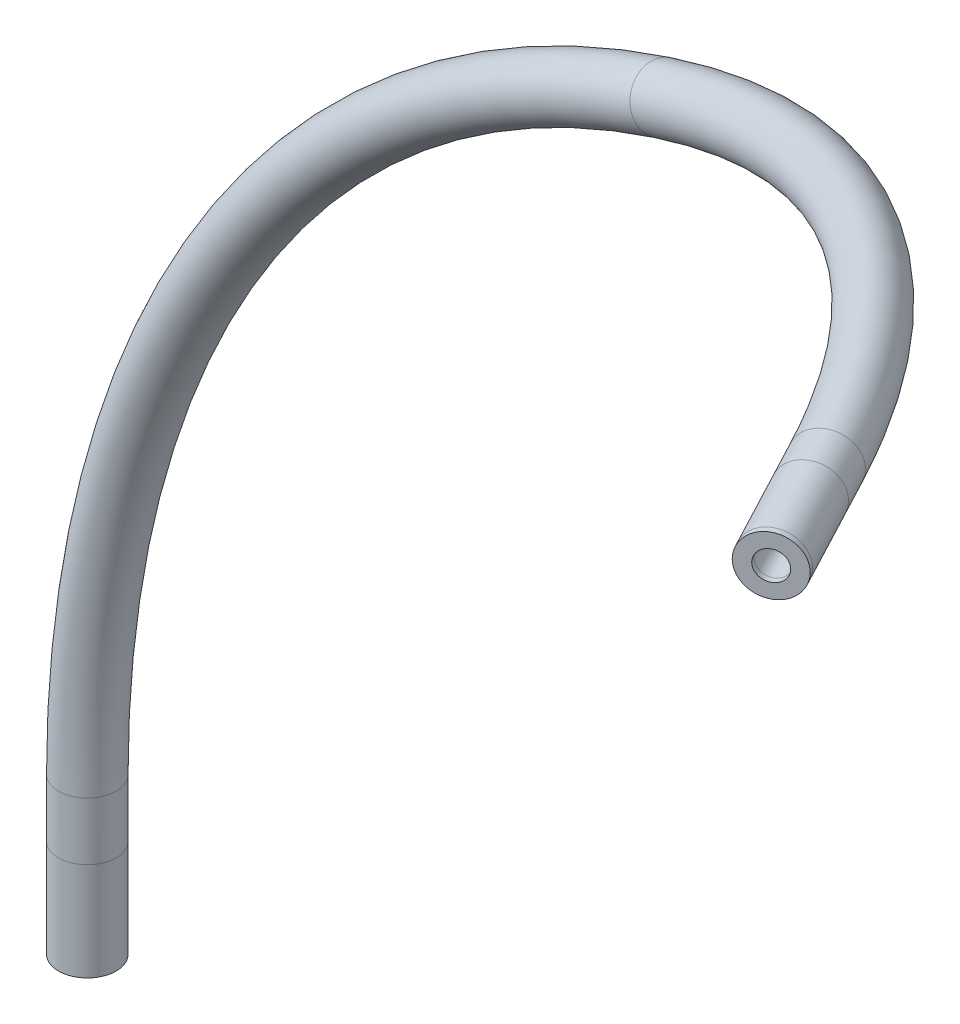
ISO-10303-21;
HEADER;
FILE_DESCRIPTION(('STEP AP214'),'2;1');
FILE_NAME('part.step','',(''),(''),'','','');
FILE_SCHEMA(('AUTOMOTIVE_DESIGN { 1 0 10303 214 1 1 1 1 }'));
ENDSEC;
DATA;
#1=APPLICATION_CONTEXT('core data for automotive mechanical design processes');
#2=APPLICATION_PROTOCOL_DEFINITION('international standard','automotive_design',2000,#1);
#3=PRODUCT_CONTEXT('',#1,'mechanical');
#4=PRODUCT('Part','Part','',(#3));
#5=PRODUCT_RELATED_PRODUCT_CATEGORY('part','',(#4));
#6=PRODUCT_DEFINITION_FORMATION('','',#4);
#7=PRODUCT_DEFINITION_CONTEXT('part definition',#1,'design');
#8=PRODUCT_DEFINITION('design','',#6,#7);
#9=PRODUCT_DEFINITION_SHAPE('','',#8);
#10=(LENGTH_UNIT() NAMED_UNIT(*) SI_UNIT(.MILLI.,.METRE.));
#11=(NAMED_UNIT(*) PLANE_ANGLE_UNIT() SI_UNIT($,.RADIAN.));
#12=(NAMED_UNIT(*) SI_UNIT($,.STERADIAN.) SOLID_ANGLE_UNIT());
#13=UNCERTAINTY_MEASURE_WITH_UNIT(LENGTH_MEASURE(1.E-05),#10,'distance_accuracy_value','');
#14=(GEOMETRIC_REPRESENTATION_CONTEXT(3) GLOBAL_UNCERTAINTY_ASSIGNED_CONTEXT((#13)) GLOBAL_UNIT_ASSIGNED_CONTEXT((#10,
#11,#12)) REPRESENTATION_CONTEXT('',''));
#15=CARTESIAN_POINT('',(0.,0.,0.));
#16=DIRECTION('',(0.,0.,1.));
#17=DIRECTION('',(1.,0.,0.));
#18=AXIS2_PLACEMENT_3D('',#15,#16,#17);
#19=CARTESIAN_POINT('',(31.09118456801,1264.71763543458,-29.1166792010292));
#20=DIRECTION('',(-4.11759515372978E-12,-1.,1.12676534769207E-12));
#21=DIRECTION('',(-0.296672887755822,2.29760654946176E-12,0.954979160856729));
#22=AXIS2_PLACEMENT_3D('',#19,#20,#21);
#23=PLANE('',#22);
#24=CARTESIAN_POINT('',(31.0911845680104,1264.71763543458,-29.1166792010293));
#25=DIRECTION('',(-4.11759515372978E-12,-1.,1.12676534769207E-12));
#26=DIRECTION('',(1.,-4.11759515372978E-12,0.));
#27=AXIS2_PLACEMENT_3D('',#24,#25,#26);
#28=CIRCLE('',#27,3.175);
#29=CARTESIAN_POINT('',(34.2661845680104,1264.71763543457,-29.1166792010293));
#30=VERTEX_POINT('',#29);
#31=EDGE_CURVE('E106',#30,#30,#28,.T.);
#32=ORIENTED_EDGE('',*,*,#31,.F.);
#33=EDGE_LOOP('',(#32));
#34=FACE_BOUND('',#33,.T.);
#35=CARTESIAN_POINT('',(31.09118456801,1264.71763543458,-29.1166792010292));
#36=DIRECTION('',(-4.11759515372978E-12,-1.,1.12676534769207E-12));
#37=DIRECTION('',(-0.296672887755822,2.29760654946176E-12,0.954979160856729));
#38=AXIS2_PLACEMENT_3D('',#35,#36,#37);
#39=CIRCLE('',#38,6.35000000000001);
#40=CARTESIAN_POINT('',(29.2073117307605,1264.71763543459,-23.052561529589));
#41=VERTEX_POINT('',#40);
#42=EDGE_CURVE('E102',#41,#41,#39,.T.);
#43=ORIENTED_EDGE('',*,*,#42,.T.);
#44=EDGE_LOOP('',(#43));
#45=FACE_BOUND('',#44,.T.);
#46=ADVANCED_FACE('F65',(#34,#45),#23,.T.);
#47=CARTESIAN_POINT('',(304.214888112565,1536.69544895664,93.4698034062031));
#48=DIRECTION('',(-0.469261662659723,-0.00663061794896908,-0.883034272756979));
#49=DIRECTION('',(-0.883053684739642,0.,0.469271978566524));
#50=AXIS2_PLACEMENT_3D('',#47,#48,#49);
#51=PLANE('',#50);
#52=CARTESIAN_POINT('',(304.214888112566,1536.69544895652,93.4698034062038));
#53=DIRECTION('',(-0.469261662659723,-0.00663061794896908,-0.883034272756979));
#54=DIRECTION('',(-0.883053684739642,0.,0.469271978566524));
#55=AXIS2_PLACEMENT_3D('',#52,#53,#54);
#56=CIRCLE('',#55,3.175);
#57=CARTESIAN_POINT('',(301.411192663517,1536.69544895652,94.9597419381525));
#58=VERTEX_POINT('',#57);
#59=EDGE_CURVE('E110',#58,#58,#56,.T.);
#60=ORIENTED_EDGE('',*,*,#59,.T.);
#61=EDGE_LOOP('',(#60));
#62=FACE_BOUND('',#61,.T.);
#63=CARTESIAN_POINT('',(304.214888112565,1536.69544895664,93.4698034062031));
#64=DIRECTION('',(-0.469261662659723,-0.00663061794896908,-0.883034272756979));
#65=DIRECTION('',(-0.883053684739642,0.,0.469271978566524));
#66=AXIS2_PLACEMENT_3D('',#63,#64,#65);
#67=CIRCLE('',#66,6.35000000000001);
#68=CARTESIAN_POINT('',(298.607497214468,1536.69544895664,96.4496804701005));
#69=VERTEX_POINT('',#68);
#70=EDGE_CURVE('E11',#69,#69,#67,.T.);
#71=ORIENTED_EDGE('',*,*,#70,.F.);
#72=EDGE_LOOP('',(#71));
#73=FACE_BOUND('',#72,.T.);
#74=ADVANCED_FACE('F140',(#62,#73),#51,.F.);
#75=CARTESIAN_POINT('',(31.09118456801,1264.71763543458,-29.1166792010292));
#76=DIRECTION('',(3.94125317015351E-12,1.,-1.14159106747005E-12));
#77=DIRECTION('',(-1.,3.94125317015351E-12,0.));
#78=AXIS2_PLACEMENT_3D('',#75,#76,#77);
#79=CYLINDRICAL_SURFACE('',#78,6.35000000000001);
#80=CARTESIAN_POINT('',(31.091184568095,1286.30763543458,-29.1166792010539));
#81=DIRECTION('',(-4.11759515372978E-12,-1.,1.12676534769207E-12));
#82=DIRECTION('',(-0.296672887755822,2.29760654946176E-12,0.954979160856729));
#83=AXIS2_PLACEMENT_3D('',#80,#81,#82);
#84=CIRCLE('',#83,6.35000000000001);
#85=CARTESIAN_POINT('',(29.2073117308455,1286.30763543459,-23.0525615296136));
#86=VERTEX_POINT('',#85);
#87=EDGE_CURVE('E98',#86,#86,#84,.T.);
#88=ORIENTED_EDGE('',*,*,#87,.T.);
#89=EDGE_LOOP('',(#88));
#90=FACE_BOUND('',#89,.T.);
#91=ORIENTED_EDGE('',*,*,#42,.F.);
#92=EDGE_LOOP('',(#91));
#93=FACE_BOUND('',#92,.T.);
#94=ADVANCED_FACE('F190',(#90,#93),#79,.T.);
#95=CARTESIAN_POINT('',(31.0911845680955,1286.30763543458,-29.1166792010538));
#96=DIRECTION('',(3.94069073086065E-12,1.,-1.13918061335798E-12));
#97=DIRECTION('',(-1.,3.94069073086065E-12,0.));
#98=AXIS2_PLACEMENT_3D('',#95,#96,#97);
#99=CYLINDRICAL_SURFACE('',#98,6.35000000000001);
#100=CARTESIAN_POINT('',(31.0911845681454,1299.00763543458,-29.1166792010683));
#101=DIRECTION('',(-4.11702616442966E-12,-1.,1.12437836818913E-12));
#102=DIRECTION('',(-0.296672887755822,2.29510854765635E-12,0.954979160856729));
#103=AXIS2_PLACEMENT_3D('',#100,#101,#102);
#104=CIRCLE('',#103,6.35000000000001);
#105=CARTESIAN_POINT('',(24.7713274061814,1299.0076354346,-29.7346641947015));
#106=VERTEX_POINT('',#105);
#107=EDGE_CURVE('E94',#106,#106,#104,.T.);
#108=ORIENTED_EDGE('',*,*,#107,.T.);
#109=EDGE_LOOP('',(#108));
#110=FACE_BOUND('',#109,.T.);
#111=ORIENTED_EDGE('',*,*,#87,.F.);
#112=EDGE_LOOP('',(#111));
#113=FACE_BOUND('',#112,.T.);
#114=ADVANCED_FACE('F192',(#110,#113),#99,.T.);
#115=CARTESIAN_POINT('',(251.153474751033,1299.00763543374,-7.59796611747635));
#116=DIRECTION('',(0.0973204714383247,-1.51938229919532E-12,-0.995253096372487));
#117=DIRECTION('',(-0.995253096372487,0.,-0.0973204714383248));
#118=AXIS2_PLACEMENT_3D('',#115,#116,#117);
#119=TOROIDAL_SURFACE('',#118,221.11188700138,6.35000000000001);
#120=CARTESIAN_POINT('',(171.500120085077,1505.12688026292,-15.386841184836));
#121=DIRECTION('',(-0.9277692819697,-0.361958219192179,-0.0907215905540296));
#122=DIRECTION('',(-0.168193497415296,0.188606763635169,0.967542472524219));
#123=AXIS2_PLACEMENT_3D('',#120,#121,#122);
#124=CIRCLE('',#123,6.35000000000001);
#125=CARTESIAN_POINT('',(169.212595841183,1511.04631418579,-15.6105259326281));
#126=VERTEX_POINT('',#125);
#127=EDGE_CURVE('E90',#126,#126,#124,.T.);
#128=CARTESIAN_POINT('',(251.153474751033,1299.00763543374,-7.59796611747635));
#129=DIRECTION('',(0.0973204714383247,-1.51938229919532E-12,-0.995253096372487));
#130=DIRECTION('',(-0.995253096372487,0.,-0.0973204714383248));
#131=AXIS2_PLACEMENT_3D('',#128,#129,#130);
#132=CIRCLE('',#131,227.46188700138);
#133=EDGE_CURVE('',#106,#126,#132,.T.);
#134=ORIENTED_EDGE('',*,*,#107,.F.);
#135=ORIENTED_EDGE('',*,*,#127,.T.);
#136=ORIENTED_EDGE('',*,*,#133,.T.);
#137=ORIENTED_EDGE('',*,*,#133,.F.);
#138=EDGE_LOOP('',(#134,#136,#135,#137));
#139=FACE_BOUND('',#138,.T.);
#140=ADVANCED_FACE('F199',(#139),#119,.T.);
#141=CARTESIAN_POINT('',(169.521268889301,1473.20357530099,132.216611157745));
#142=DIRECTION('',(0.372924235293047,-0.90791419309011,-0.1913617848909));
#143=DIRECTION('',(0.925008752116301,0.37994579680297,0.));
#144=AXIS2_PLACEMENT_3D('',#141,#142,#143);
#145=TOROIDAL_SURFACE('',#144,151.029111085233,6.35000000000001);
#146=CARTESIAN_POINT('',(290.412596724833,1536.50042403065,67.4973080848133));
#147=DIRECTION('',(-0.469261662659723,-0.00663061794896908,-0.883034272756979));
#148=DIRECTION('',(-0.883053684739642,0.,0.469271978566524));
#149=AXIS2_PLACEMENT_3D('',#146,#147,#148);
#150=CIRCLE('',#149,6.35000000000001);
#151=CARTESIAN_POINT('',(284.805205826736,1536.50042403065,70.4771851487108));
#152=VERTEX_POINT('',#151);
#153=EDGE_CURVE('E84',#152,#152,#150,.T.);
#154=ORIENTED_EDGE('',*,*,#153,.T.);
#155=EDGE_LOOP('',(#154));
#156=FACE_BOUND('',#155,.T.);
#157=ORIENTED_EDGE('',*,*,#127,.F.);
#158=EDGE_LOOP('',(#157));
#159=FACE_BOUND('',#158,.T.);
#160=ADVANCED_FACE('F214',(#156,#159),#145,.T.);
#161=CARTESIAN_POINT('',(290.412596724844,1536.50042403065,67.4973080848385));
#162=DIRECTION('',(0.469261662659727,0.00663061794929569,0.883034272756974));
#163=DIRECTION('',(0.88305368473964,0.,-0.46927197856653));
#164=AXIS2_PLACEMENT_3D('',#161,#162,#163);
#165=CYLINDRICAL_SURFACE('',#164,6.35000000000001);
#166=CARTESIAN_POINT('',(294.623377186723,1536.5599219158,75.4209544398789));
#167=DIRECTION('',(-0.469261662659723,-0.00663061794896908,-0.883034272756979));
#168=DIRECTION('',(-0.883053684739642,0.,0.469271978566524));
#169=AXIS2_PLACEMENT_3D('',#166,#167,#168);
#170=CIRCLE('',#169,6.35000000000001);
#171=CARTESIAN_POINT('',(289.015986288626,1536.5599219158,78.4008315037763));
#172=VERTEX_POINT('',#171);
#173=EDGE_CURVE('E78',#172,#172,#170,.T.);
#174=ORIENTED_EDGE('',*,*,#173,.T.);
#175=EDGE_LOOP('',(#174));
#176=FACE_BOUND('',#175,.T.);
#177=ORIENTED_EDGE('',*,*,#153,.F.);
#178=EDGE_LOOP('',(#177));
#179=FACE_BOUND('',#178,.T.);
#180=ADVANCED_FACE('F208',(#176,#179),#165,.T.);
#181=CARTESIAN_POINT('',(294.623377186711,1536.5599219158,75.4209544398534));
#182=DIRECTION('',(0.469261662659722,0.00663061794927835,0.883034272756977));
#183=DIRECTION('',(0.883053684739642,0.,-0.469271978566524));
#184=AXIS2_PLACEMENT_3D('',#181,#182,#183);
#185=CYLINDRICAL_SURFACE('',#184,6.35000000000001);
#186=CARTESIAN_POINT('',(303.611412933312,1536.68692191579,92.3342125228376));
#187=DIRECTION('',(-0.469261662659723,-0.00663061794896908,-0.883034272756979));
#188=DIRECTION('',(-0.883053684739642,0.,0.469271978566524));
#189=AXIS2_PLACEMENT_3D('',#186,#187,#188);
#190=CIRCLE('',#189,6.35000000000001);
#191=CARTESIAN_POINT('',(298.004022035216,1536.68692191579,95.314089586735));
#192=VERTEX_POINT('',#191);
#193=EDGE_CURVE('E72',#192,#192,#190,.T.);
#194=ORIENTED_EDGE('',*,*,#193,.T.);
#195=EDGE_LOOP('',(#194));
#196=FACE_BOUND('',#195,.T.);
#197=ORIENTED_EDGE('',*,*,#173,.F.);
#198=EDGE_LOOP('',(#197));
#199=FACE_BOUND('',#198,.T.);
#200=ADVANCED_FACE('F203',(#196,#199),#185,.T.);
#201=CARTESIAN_POINT('',(303.611412933218,1536.68692191582,92.334212522641));
#202=DIRECTION('',(0.469261662659689,0.00663061794914187,0.883034272756996));
#203=DIRECTION('',(0.88305368473966,0.,-0.469271978566491));
#204=AXIS2_PLACEMENT_3D('',#201,#202,#203);
#205=CYLINDRICAL_SURFACE('',#204,6.35000000000001);
#206=ORIENTED_EDGE('',*,*,#70,.T.);
#207=EDGE_LOOP('',(#206));
#208=FACE_BOUND('',#207,.T.);
#209=ORIENTED_EDGE('',*,*,#193,.F.);
#210=EDGE_LOOP('',(#209));
#211=FACE_BOUND('',#210,.T.);
#212=ADVANCED_FACE('F182',(#208,#211),#205,.T.);
#213=CARTESIAN_POINT('',(31.0911845679906,1259.71763543458,-29.1166792010236));
#214=DIRECTION('',(3.94126042236601E-12,1.,-1.14156417384891E-12));
#215=DIRECTION('',(-1.,3.94126042236601E-12,0.));
#216=AXIS2_PLACEMENT_3D('',#213,#214,#215);
#217=CYLINDRICAL_SURFACE('',#216,3.175);
#218=CARTESIAN_POINT('',(31.0911845680952,1286.30763543458,-29.1166792010539));
#219=DIRECTION('',(-3.94143051529738E-12,-1.,1.14147580276835E-12));
#220=DIRECTION('',(-0.296672887755821,2.25947038856589E-12,0.954979160856729));
#221=AXIS2_PLACEMENT_3D('',#218,#219,#220);
#222=CIRCLE('',#221,3.175);
#223=CARTESIAN_POINT('',(30.1492481494705,1286.30763543459,-26.0846203653338));
#224=VERTEX_POINT('',#223);
#225=EDGE_CURVE('E111',#224,#224,#222,.T.);
#226=ORIENTED_EDGE('',*,*,#225,.F.);
#227=EDGE_LOOP('',(#226));
#228=FACE_BOUND('',#227,.T.);
#229=ORIENTED_EDGE('',*,*,#31,.T.);
#230=EDGE_LOOP('',(#229));
#231=FACE_BOUND('',#230,.T.);
#232=ADVANCED_FACE('F148',(#228,#231),#217,.F.);
#233=CARTESIAN_POINT('',(31.0911845680955,1286.30763543458,-29.116679201054));
#234=DIRECTION('',(3.94069073086065E-12,1.,-1.13918061335798E-12));
#235=DIRECTION('',(-1.,3.94069073086065E-12,0.));
#236=AXIS2_PLACEMENT_3D('',#233,#234,#235);
#237=CYLINDRICAL_SURFACE('',#236,3.175);
#238=CARTESIAN_POINT('',(31.0911845681454,1299.00763543458,-29.1166792010685));
#239=DIRECTION('',(-3.94070887033138E-12,-1.,1.13919984556787E-12));
#240=DIRECTION('',(-0.296672887755821,2.25708340906294E-12,0.954979160856729));
#241=AXIS2_PLACEMENT_3D('',#238,#239,#240);
#242=CIRCLE('',#241,3.175);
#243=CARTESIAN_POINT('',(27.9312559871641,1299.00763543459,-29.4256716978851));
#244=VERTEX_POINT('',#243);
#245=EDGE_CURVE('E115',#244,#244,#242,.T.);
#246=ORIENTED_EDGE('',*,*,#245,.F.);
#247=EDGE_LOOP('',(#246));
#248=FACE_BOUND('',#247,.T.);
#249=ORIENTED_EDGE('',*,*,#225,.T.);
#250=EDGE_LOOP('',(#249));
#251=FACE_BOUND('',#250,.T.);
#252=ADVANCED_FACE('F171',(#248,#251),#237,.F.);
#253=CARTESIAN_POINT('',(251.153474751033,1299.00763543374,-7.59796611747668));
#254=DIRECTION('',(0.0973204714383247,-1.51938229919532E-12,-0.995253096372487));
#255=DIRECTION('',(-0.995253096372487,0.,-0.0973204714383248));
#256=AXIS2_PLACEMENT_3D('',#253,#254,#255);
#257=TOROIDAL_SURFACE('',#256,221.11188700138,3.175);
#258=CARTESIAN_POINT('',(171.500120085077,1505.12688026292,-15.3868411848361));
#259=DIRECTION('',(-0.927769281969637,-0.361958219192344,-0.0907215905540257));
#260=DIRECTION('',(-0.168193497415331,0.188606763635155,0.967542472524215));
#261=AXIS2_PLACEMENT_3D('',#258,#259,#260);
#262=CIRCLE('',#261,3.175);
#263=CARTESIAN_POINT('',(170.35635796313,1508.08659722436,-15.4986835587322));
#264=VERTEX_POINT('',#263);
#265=EDGE_CURVE('E119',#264,#264,#262,.T.);
#266=CARTESIAN_POINT('',(251.153474751033,1299.00763543374,-7.59796611747668));
#267=DIRECTION('',(0.0973204714383247,-1.51938229919532E-12,-0.995253096372487));
#268=DIRECTION('',(-0.995253096372487,0.,-0.0973204714383248));
#269=AXIS2_PLACEMENT_3D('',#266,#267,#268);
#270=CIRCLE('',#269,224.28688700138);
#271=EDGE_CURVE('',#244,#264,#270,.T.);
#272=ORIENTED_EDGE('',*,*,#245,.T.);
#273=ORIENTED_EDGE('',*,*,#265,.F.);
#274=ORIENTED_EDGE('',*,*,#271,.T.);
#275=ORIENTED_EDGE('',*,*,#271,.F.);
#276=EDGE_LOOP('',(#272,#274,#273,#275));
#277=FACE_BOUND('',#276,.T.);
#278=ADVANCED_FACE('F165',(#277),#257,.F.);
#279=CARTESIAN_POINT('',(169.521268889301,1473.20357530099,132.216611157745));
#280=DIRECTION('',(0.372924235293047,-0.90791419309011,-0.1913617848909));
#281=DIRECTION('',(0.925008752116301,0.37994579680297,0.));
#282=AXIS2_PLACEMENT_3D('',#279,#280,#281);
#283=TOROIDAL_SURFACE('',#282,151.029111085233,3.175);
#284=CARTESIAN_POINT('',(290.412596724961,1536.50042403061,67.4973080850361));
#285=DIRECTION('',(-0.469261662659723,-0.00663061794896908,-0.883034272756979));
#286=DIRECTION('',(-0.883053684739642,0.,0.469271978566524));
#287=AXIS2_PLACEMENT_3D('',#284,#285,#286);
#288=CIRCLE('',#287,3.175);
#289=CARTESIAN_POINT('',(287.608901275913,1536.50042403061,68.9872466169848));
#290=VERTEX_POINT('',#289);
#291=EDGE_CURVE('E123',#290,#290,#288,.T.);
#292=ORIENTED_EDGE('',*,*,#291,.F.);
#293=EDGE_LOOP('',(#292));
#294=FACE_BOUND('',#293,.T.);
#295=ORIENTED_EDGE('',*,*,#265,.T.);
#296=EDGE_LOOP('',(#295));
#297=FACE_BOUND('',#296,.T.);
#298=ADVANCED_FACE('F159',(#294,#297),#283,.F.);
#299=CARTESIAN_POINT('',(290.412596724973,1536.50042403061,67.4973080850611));
#300=DIRECTION('',(0.469261662659727,0.00663061794929569,0.883034272756974));
#301=DIRECTION('',(0.88305368473964,0.,-0.46927197856653));
#302=AXIS2_PLACEMENT_3D('',#299,#300,#301);
#303=CYLINDRICAL_SURFACE('',#302,3.175);
#304=CARTESIAN_POINT('',(294.623377186851,1536.55992191576,75.4209544401015));
#305=DIRECTION('',(-0.469261662659723,-0.00663061794896908,-0.883034272756979));
#306=DIRECTION('',(-0.883053684739642,0.,0.469271978566524));
#307=AXIS2_PLACEMENT_3D('',#304,#305,#306);
#308=CIRCLE('',#307,3.175);
#309=CARTESIAN_POINT('',(291.819681737803,1536.55992191576,76.9108929720502));
#310=VERTEX_POINT('',#309);
#311=EDGE_CURVE('E127',#310,#310,#308,.T.);
#312=ORIENTED_EDGE('',*,*,#311,.F.);
#313=EDGE_LOOP('',(#312));
#314=FACE_BOUND('',#313,.T.);
#315=ORIENTED_EDGE('',*,*,#291,.T.);
#316=EDGE_LOOP('',(#315));
#317=FACE_BOUND('',#316,.T.);
#318=ADVANCED_FACE('F153',(#314,#317),#303,.F.);
#319=CARTESIAN_POINT('',(294.623377186839,1536.55992191576,75.420954440076));
#320=DIRECTION('',(0.469261662659722,0.00663061794927835,0.883034272756977));
#321=DIRECTION('',(0.883053684739642,0.,-0.469271978566524));
#322=AXIS2_PLACEMENT_3D('',#319,#320,#321);
#323=CYLINDRICAL_SURFACE('',#322,3.175);
#324=CARTESIAN_POINT('',(303.611412933441,1536.68692191575,92.3342125230603));
#325=DIRECTION('',(-0.469261662659723,-0.00663061794896908,-0.883034272756979));
#326=DIRECTION('',(-0.883053684739642,0.,0.469271978566524));
#327=AXIS2_PLACEMENT_3D('',#324,#325,#326);
#328=CIRCLE('',#327,3.175);
#329=CARTESIAN_POINT('',(300.807717484393,1536.68692191575,93.824151055009));
#330=VERTEX_POINT('',#329);
#331=EDGE_CURVE('E131',#330,#330,#328,.T.);
#332=ORIENTED_EDGE('',*,*,#331,.F.);
#333=EDGE_LOOP('',(#332));
#334=FACE_BOUND('',#333,.T.);
#335=ORIENTED_EDGE('',*,*,#311,.T.);
#336=EDGE_LOOP('',(#335));
#337=FACE_BOUND('',#336,.T.);
#338=ADVANCED_FACE('F146',(#334,#337),#323,.F.);
#339=CARTESIAN_POINT('',(303.611412933592,1536.6869219157,92.3342125233437));
#340=DIRECTION('',(0.469261662659686,0.0066306179491571,0.883034272756998));
#341=DIRECTION('',(0.883053684739662,0.,-0.469271978566488));
#342=AXIS2_PLACEMENT_3D('',#339,#340,#341);
#343=CYLINDRICAL_SURFACE('',#342,3.175);
#344=ORIENTED_EDGE('',*,*,#59,.F.);
#345=EDGE_LOOP('',(#344));
#346=FACE_BOUND('',#345,.T.);
#347=ORIENTED_EDGE('',*,*,#331,.T.);
#348=EDGE_LOOP('',(#347));
#349=FACE_BOUND('',#348,.T.);
#350=ADVANCED_FACE('F143',(#346,#349),#343,.F.);
#351=CLOSED_SHELL('',(#46,#74,#94,#114,#140,#160,#180,#200,#212,#232,#252,#278,#298,#318,#338,#350));
#352=MANIFOLD_SOLID_BREP('B2',#351);
#353=ADVANCED_BREP_SHAPE_REPRESENTATION('',(#18,#352),#14);
#354=SHAPE_DEFINITION_REPRESENTATION(#9,#353);
ENDSEC;
END-ISO-10303-21;
